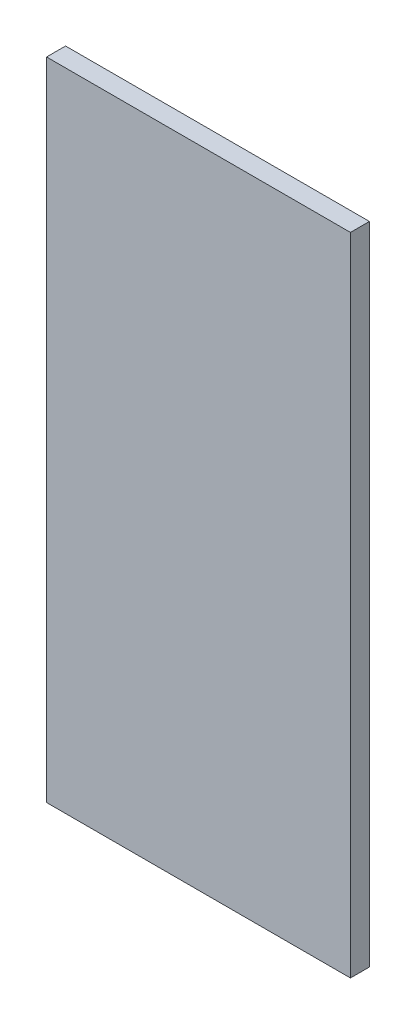
ISO-10303-21;
HEADER;
FILE_DESCRIPTION(('STEP AP214'),'2;1');
FILE_NAME('part.step','',(''),(''),'','','');
FILE_SCHEMA(('AUTOMOTIVE_DESIGN { 1 0 10303 214 1 1 1 1 }'));
ENDSEC;
DATA;
#1=APPLICATION_CONTEXT('core data for automotive mechanical design processes');
#2=APPLICATION_PROTOCOL_DEFINITION('international standard','automotive_design',2000,#1);
#3=PRODUCT_CONTEXT('',#1,'mechanical');
#4=PRODUCT('Part','Part','',(#3));
#5=PRODUCT_RELATED_PRODUCT_CATEGORY('part','',(#4));
#6=PRODUCT_DEFINITION_FORMATION('','',#4);
#7=PRODUCT_DEFINITION_CONTEXT('part definition',#1,'design');
#8=PRODUCT_DEFINITION('design','',#6,#7);
#9=PRODUCT_DEFINITION_SHAPE('','',#8);
#10=(LENGTH_UNIT() NAMED_UNIT(*) SI_UNIT(.MILLI.,.METRE.));
#11=(NAMED_UNIT(*) PLANE_ANGLE_UNIT() SI_UNIT($,.RADIAN.));
#12=(NAMED_UNIT(*) SI_UNIT($,.STERADIAN.) SOLID_ANGLE_UNIT());
#13=UNCERTAINTY_MEASURE_WITH_UNIT(LENGTH_MEASURE(1.E-05),#10,'distance_accuracy_value','');
#14=(GEOMETRIC_REPRESENTATION_CONTEXT(3) GLOBAL_UNCERTAINTY_ASSIGNED_CONTEXT((#13)) GLOBAL_UNIT_ASSIGNED_CONTEXT((#10,
#11,#12)) REPRESENTATION_CONTEXT('',''));
#15=CARTESIAN_POINT('',(0.,0.,0.));
#16=DIRECTION('',(0.,0.,1.));
#17=DIRECTION('',(1.,0.,0.));
#18=AXIS2_PLACEMENT_3D('',#15,#16,#17);
#19=CARTESIAN_POINT('',(-20.,-42.5,2.5));
#20=DIRECTION('',(1.,0.,0.));
#21=DIRECTION('',(0.,0.,-1.));
#22=AXIS2_PLACEMENT_3D('',#19,#20,#21);
#23=PLANE('',#22);
#24=DIRECTION('',(0.,-1.,0.));
#25=VECTOR('',#24,1.);
#26=CARTESIAN_POINT('',(-20.,-42.5,0.));
#27=LINE('',#26,#25);
#28=CARTESIAN_POINT('',(-20.,42.5,0.));
#29=VERTEX_POINT('',#28);
#30=CARTESIAN_POINT('',(-20.,-42.5,0.));
#31=VERTEX_POINT('',#30);
#32=EDGE_CURVE('E113',#29,#31,#27,.T.);
#33=ORIENTED_EDGE('',*,*,#32,.T.);
#34=DIRECTION('',(0.,0.,-1.));
#35=VECTOR('',#34,1.);
#36=CARTESIAN_POINT('',(-20.,-42.5,2.5));
#37=LINE('',#36,#35);
#38=CARTESIAN_POINT('',(-20.,-42.5,2.5));
#39=VERTEX_POINT('',#38);
#40=EDGE_CURVE('E11',#39,#31,#37,.T.);
#41=ORIENTED_EDGE('',*,*,#40,.F.);
#42=DIRECTION('',(0.,-1.,0.));
#43=VECTOR('',#42,1.);
#44=CARTESIAN_POINT('',(-20.,-42.5,2.5));
#45=LINE('',#44,#43);
#46=CARTESIAN_POINT('',(-20.,42.5,2.5));
#47=VERTEX_POINT('',#46);
#48=EDGE_CURVE('E97',#47,#39,#45,.T.);
#49=ORIENTED_EDGE('',*,*,#48,.F.);
#50=DIRECTION('',(0.,0.,-1.));
#51=VECTOR('',#50,1.);
#52=CARTESIAN_POINT('',(-20.,42.5,2.5));
#53=LINE('',#52,#51);
#54=EDGE_CURVE('E109',#47,#29,#53,.T.);
#55=ORIENTED_EDGE('',*,*,#54,.T.);
#56=EDGE_LOOP('',(#33,#41,#49,#55));
#57=FACE_BOUND('',#56,.T.);
#58=ADVANCED_FACE('F45',(#57),#23,.F.);
#59=CARTESIAN_POINT('',(20.,-42.5,2.5));
#60=DIRECTION('',(0.,1.,0.));
#61=DIRECTION('',(0.,0.,1.));
#62=AXIS2_PLACEMENT_3D('',#59,#60,#61);
#63=PLANE('',#62);
#64=DIRECTION('',(1.,0.,0.));
#65=VECTOR('',#64,1.);
#66=CARTESIAN_POINT('',(20.,-42.5,0.));
#67=LINE('',#66,#65);
#68=CARTESIAN_POINT('',(20.,-42.5,0.));
#69=VERTEX_POINT('',#68);
#70=EDGE_CURVE('E102',#31,#69,#67,.T.);
#71=ORIENTED_EDGE('',*,*,#70,.T.);
#72=DIRECTION('',(0.,0.,-1.));
#73=VECTOR('',#72,1.);
#74=CARTESIAN_POINT('',(20.,-42.5,2.5));
#75=LINE('',#74,#73);
#76=CARTESIAN_POINT('',(20.,-42.5,2.5));
#77=VERTEX_POINT('',#76);
#78=EDGE_CURVE('E54',#77,#69,#75,.T.);
#79=ORIENTED_EDGE('',*,*,#78,.F.);
#80=DIRECTION('',(1.,0.,0.));
#81=VECTOR('',#80,1.);
#82=CARTESIAN_POINT('',(20.,-42.5,2.5));
#83=LINE('',#82,#81);
#84=EDGE_CURVE('E92',#39,#77,#83,.T.);
#85=ORIENTED_EDGE('',*,*,#84,.F.);
#86=ORIENTED_EDGE('',*,*,#40,.T.);
#87=EDGE_LOOP('',(#71,#79,#85,#86));
#88=FACE_BOUND('',#87,.T.);
#89=ADVANCED_FACE('F101',(#88),#63,.F.);
#90=CARTESIAN_POINT('',(20.,-42.5,2.5));
#91=DIRECTION('',(-1.,0.,0.));
#92=DIRECTION('',(0.,0.,1.));
#93=AXIS2_PLACEMENT_3D('',#90,#91,#92);
#94=PLANE('',#93);
#95=DIRECTION('',(0.,1.,0.));
#96=VECTOR('',#95,1.);
#97=CARTESIAN_POINT('',(20.,-42.5,0.));
#98=LINE('',#97,#96);
#99=CARTESIAN_POINT('',(20.,42.5,0.));
#100=VERTEX_POINT('',#99);
#101=EDGE_CURVE('E79',#69,#100,#98,.T.);
#102=ORIENTED_EDGE('',*,*,#101,.T.);
#103=DIRECTION('',(0.,0.,-1.));
#104=VECTOR('',#103,1.);
#105=CARTESIAN_POINT('',(20.,42.5,2.5));
#106=LINE('',#105,#104);
#107=CARTESIAN_POINT('',(20.,42.5,2.5));
#108=VERTEX_POINT('',#107);
#109=EDGE_CURVE('E104',#108,#100,#106,.T.);
#110=ORIENTED_EDGE('',*,*,#109,.F.);
#111=DIRECTION('',(0.,1.,0.));
#112=VECTOR('',#111,1.);
#113=CARTESIAN_POINT('',(20.,-42.5,2.5));
#114=LINE('',#113,#112);
#115=EDGE_CURVE('E95',#77,#108,#114,.T.);
#116=ORIENTED_EDGE('',*,*,#115,.F.);
#117=ORIENTED_EDGE('',*,*,#78,.T.);
#118=EDGE_LOOP('',(#102,#110,#116,#117));
#119=FACE_BOUND('',#118,.T.);
#120=ADVANCED_FACE('F105',(#119),#94,.F.);
#121=CARTESIAN_POINT('',(20.,42.5,2.5));
#122=DIRECTION('',(0.,-1.,0.));
#123=DIRECTION('',(0.,0.,-1.));
#124=AXIS2_PLACEMENT_3D('',#121,#122,#123);
#125=PLANE('',#124);
#126=DIRECTION('',(-1.,0.,0.));
#127=VECTOR('',#126,1.);
#128=CARTESIAN_POINT('',(20.,42.5,0.));
#129=LINE('',#128,#127);
#130=EDGE_CURVE('E85',#100,#29,#129,.T.);
#131=ORIENTED_EDGE('',*,*,#130,.T.);
#132=ORIENTED_EDGE('',*,*,#54,.F.);
#133=DIRECTION('',(-1.,0.,0.));
#134=VECTOR('',#133,1.);
#135=CARTESIAN_POINT('',(20.,42.5,2.5));
#136=LINE('',#135,#134);
#137=EDGE_CURVE('E62',#108,#47,#136,.T.);
#138=ORIENTED_EDGE('',*,*,#137,.F.);
#139=ORIENTED_EDGE('',*,*,#109,.T.);
#140=EDGE_LOOP('',(#131,#132,#138,#139));
#141=FACE_BOUND('',#140,.T.);
#142=ADVANCED_FACE('F126',(#141),#125,.F.);
#143=CARTESIAN_POINT('',(0.,0.,2.5));
#144=DIRECTION('',(0.,0.,1.));
#145=DIRECTION('',(1.,0.,0.));
#146=AXIS2_PLACEMENT_3D('',#143,#144,#145);
#147=PLANE('',#146);
#148=ORIENTED_EDGE('',*,*,#48,.T.);
#149=ORIENTED_EDGE('',*,*,#84,.T.);
#150=ORIENTED_EDGE('',*,*,#115,.T.);
#151=ORIENTED_EDGE('',*,*,#137,.T.);
#152=EDGE_LOOP('',(#148,#149,#150,#151));
#153=FACE_BOUND('',#152,.T.);
#154=ADVANCED_FACE('F93',(#153),#147,.T.);
#155=CARTESIAN_POINT('',(0.,0.,0.));
#156=DIRECTION('',(0.,0.,1.));
#157=DIRECTION('',(1.,0.,0.));
#158=AXIS2_PLACEMENT_3D('',#155,#156,#157);
#159=PLANE('',#158);
#160=ORIENTED_EDGE('',*,*,#32,.F.);
#161=ORIENTED_EDGE('',*,*,#130,.F.);
#162=ORIENTED_EDGE('',*,*,#101,.F.);
#163=ORIENTED_EDGE('',*,*,#70,.F.);
#164=EDGE_LOOP('',(#160,#161,#162,#163));
#165=FACE_BOUND('',#164,.T.);
#166=ADVANCED_FACE('F129',(#165),#159,.F.);
#167=CLOSED_SHELL('',(#58,#89,#120,#142,#154,#166));
#168=MANIFOLD_SOLID_BREP('B2',#167);
#169=ADVANCED_BREP_SHAPE_REPRESENTATION('',(#18,#168),#14);
#170=SHAPE_DEFINITION_REPRESENTATION(#9,#169);
ENDSEC;
END-ISO-10303-21;
